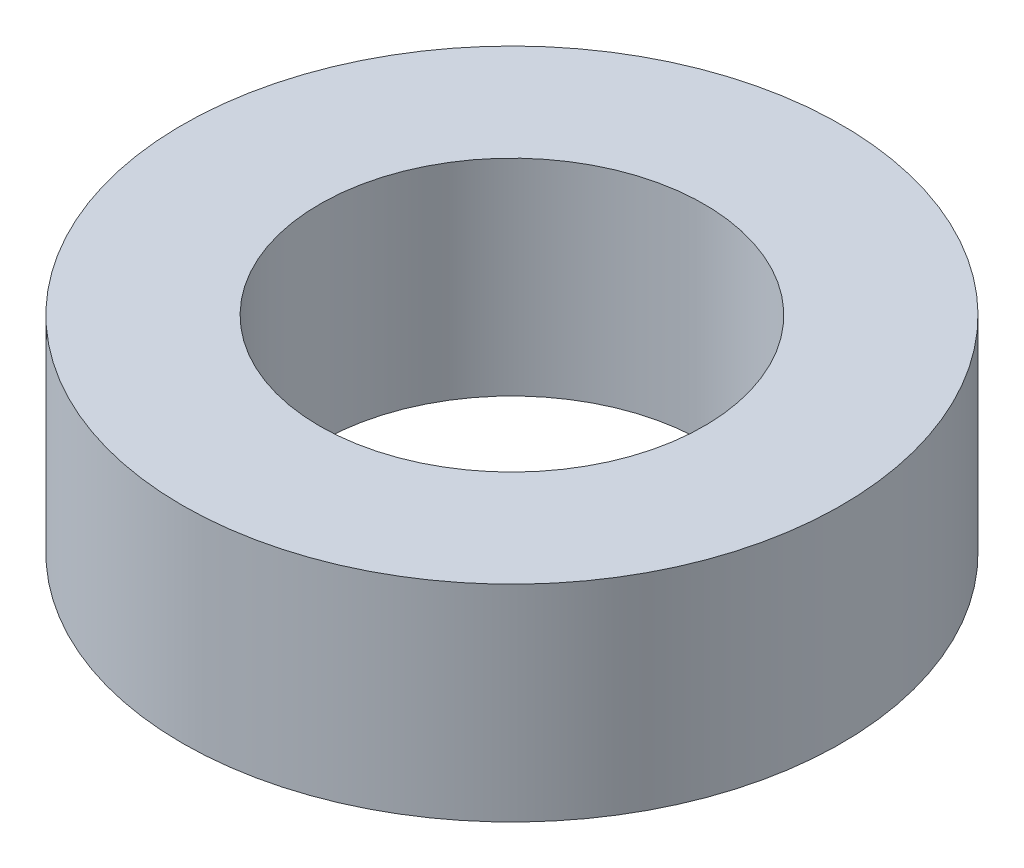
ISO-10303-21;
HEADER;
FILE_DESCRIPTION(('STEP AP214'),'2;1');
FILE_NAME('part.step','',(''),(''),'','','');
FILE_SCHEMA(('AUTOMOTIVE_DESIGN { 1 0 10303 214 1 1 1 1 }'));
ENDSEC;
DATA;
#1=APPLICATION_CONTEXT('core data for automotive mechanical design processes');
#2=APPLICATION_PROTOCOL_DEFINITION('international standard','automotive_design',2000,#1);
#3=PRODUCT_CONTEXT('',#1,'mechanical');
#4=PRODUCT('Part','Part','',(#3));
#5=PRODUCT_RELATED_PRODUCT_CATEGORY('part','',(#4));
#6=PRODUCT_DEFINITION_FORMATION('','',#4);
#7=PRODUCT_DEFINITION_CONTEXT('part definition',#1,'design');
#8=PRODUCT_DEFINITION('design','',#6,#7);
#9=PRODUCT_DEFINITION_SHAPE('','',#8);
#10=(LENGTH_UNIT() NAMED_UNIT(*) SI_UNIT(.MILLI.,.METRE.));
#11=(NAMED_UNIT(*) PLANE_ANGLE_UNIT() SI_UNIT($,.RADIAN.));
#12=(NAMED_UNIT(*) SI_UNIT($,.STERADIAN.) SOLID_ANGLE_UNIT());
#13=UNCERTAINTY_MEASURE_WITH_UNIT(LENGTH_MEASURE(1.E-05),#10,'distance_accuracy_value','');
#14=(GEOMETRIC_REPRESENTATION_CONTEXT(3) GLOBAL_UNCERTAINTY_ASSIGNED_CONTEXT((#13)) GLOBAL_UNIT_ASSIGNED_CONTEXT((#10,
#11,#12)) REPRESENTATION_CONTEXT('',''));
#15=CARTESIAN_POINT('',(0.,0.,0.));
#16=DIRECTION('',(0.,0.,1.));
#17=DIRECTION('',(1.,0.,0.));
#18=AXIS2_PLACEMENT_3D('',#15,#16,#17);
#19=CARTESIAN_POINT('',(0.,3.75,0.));
#20=DIRECTION('',(0.,1.,0.));
#21=DIRECTION('',(0.,0.,1.));
#22=AXIS2_PLACEMENT_3D('',#19,#20,#21);
#23=PLANE('',#22);
#24=CARTESIAN_POINT('',(0.,3.75,0.));
#25=DIRECTION('',(0.,1.,0.));
#26=DIRECTION('',(0.,0.,1.));
#27=AXIS2_PLACEMENT_3D('',#24,#25,#26);
#28=CIRCLE('',#27,6.);
#29=CARTESIAN_POINT('',(0.,3.75,6.));
#30=VERTEX_POINT('',#29);
#31=EDGE_CURVE('E10',#30,#30,#28,.T.);
#32=ORIENTED_EDGE('',*,*,#31,.T.);
#33=EDGE_LOOP('',(#32));
#34=FACE_BOUND('',#33,.T.);
#35=CARTESIAN_POINT('',(0.,3.75,0.));
#36=DIRECTION('',(0.,1.,0.));
#37=DIRECTION('',(0.,0.,1.));
#38=AXIS2_PLACEMENT_3D('',#35,#36,#37);
#39=CIRCLE('',#38,3.5);
#40=CARTESIAN_POINT('',(0.,3.75,3.5));
#41=VERTEX_POINT('',#40);
#42=EDGE_CURVE('E43',#41,#41,#39,.T.);
#43=ORIENTED_EDGE('',*,*,#42,.F.);
#44=EDGE_LOOP('',(#43));
#45=FACE_BOUND('',#44,.T.);
#46=ADVANCED_FACE('F32',(#34,#45),#23,.T.);
#47=CARTESIAN_POINT('',(0.,0.,0.));
#48=DIRECTION('',(0.,1.,0.));
#49=DIRECTION('',(0.,0.,1.));
#50=AXIS2_PLACEMENT_3D('',#47,#48,#49);
#51=PLANE('',#50);
#52=CARTESIAN_POINT('',(0.,0.,0.));
#53=DIRECTION('',(0.,1.,0.));
#54=DIRECTION('',(0.,0.,1.));
#55=AXIS2_PLACEMENT_3D('',#52,#53,#54);
#56=CIRCLE('',#55,6.);
#57=CARTESIAN_POINT('',(0.,0.,6.));
#58=VERTEX_POINT('',#57);
#59=EDGE_CURVE('E36',#58,#58,#56,.T.);
#60=ORIENTED_EDGE('',*,*,#59,.F.);
#61=EDGE_LOOP('',(#60));
#62=FACE_BOUND('',#61,.T.);
#63=CARTESIAN_POINT('',(0.,0.,0.));
#64=DIRECTION('',(0.,1.,0.));
#65=DIRECTION('',(0.,0.,1.));
#66=AXIS2_PLACEMENT_3D('',#63,#64,#65);
#67=CIRCLE('',#66,3.5);
#68=CARTESIAN_POINT('',(0.,0.,3.5));
#69=VERTEX_POINT('',#68);
#70=EDGE_CURVE('E45',#69,#69,#67,.T.);
#71=ORIENTED_EDGE('',*,*,#70,.T.);
#72=EDGE_LOOP('',(#71));
#73=FACE_BOUND('',#72,.T.);
#74=ADVANCED_FACE('F55',(#62,#73),#51,.F.);
#75=CARTESIAN_POINT('',(0.,3.75,0.));
#76=DIRECTION('',(0.,-1.,0.));
#77=DIRECTION('',(0.,0.,-1.));
#78=AXIS2_PLACEMENT_3D('',#75,#76,#77);
#79=CYLINDRICAL_SURFACE('',#78,6.);
#80=ORIENTED_EDGE('',*,*,#31,.F.);
#81=EDGE_LOOP('',(#80));
#82=FACE_BOUND('',#81,.T.);
#83=ORIENTED_EDGE('',*,*,#59,.T.);
#84=EDGE_LOOP('',(#83));
#85=FACE_BOUND('',#84,.T.);
#86=ADVANCED_FACE('F34',(#82,#85),#79,.T.);
#87=CARTESIAN_POINT('',(0.,3.75,0.));
#88=DIRECTION('',(0.,-1.,0.));
#89=DIRECTION('',(0.,0.,-1.));
#90=AXIS2_PLACEMENT_3D('',#87,#88,#89);
#91=CYLINDRICAL_SURFACE('',#90,3.5);
#92=ORIENTED_EDGE('',*,*,#42,.T.);
#93=EDGE_LOOP('',(#92));
#94=FACE_BOUND('',#93,.T.);
#95=ORIENTED_EDGE('',*,*,#70,.F.);
#96=EDGE_LOOP('',(#95));
#97=FACE_BOUND('',#96,.T.);
#98=ADVANCED_FACE('F51',(#94,#97),#91,.F.);
#99=CLOSED_SHELL('',(#46,#74,#86,#98));
#100=MANIFOLD_SOLID_BREP('B2',#99);
#101=ADVANCED_BREP_SHAPE_REPRESENTATION('',(#18,#100),#14);
#102=SHAPE_DEFINITION_REPRESENTATION(#9,#101);
ENDSEC;
END-ISO-10303-21;
